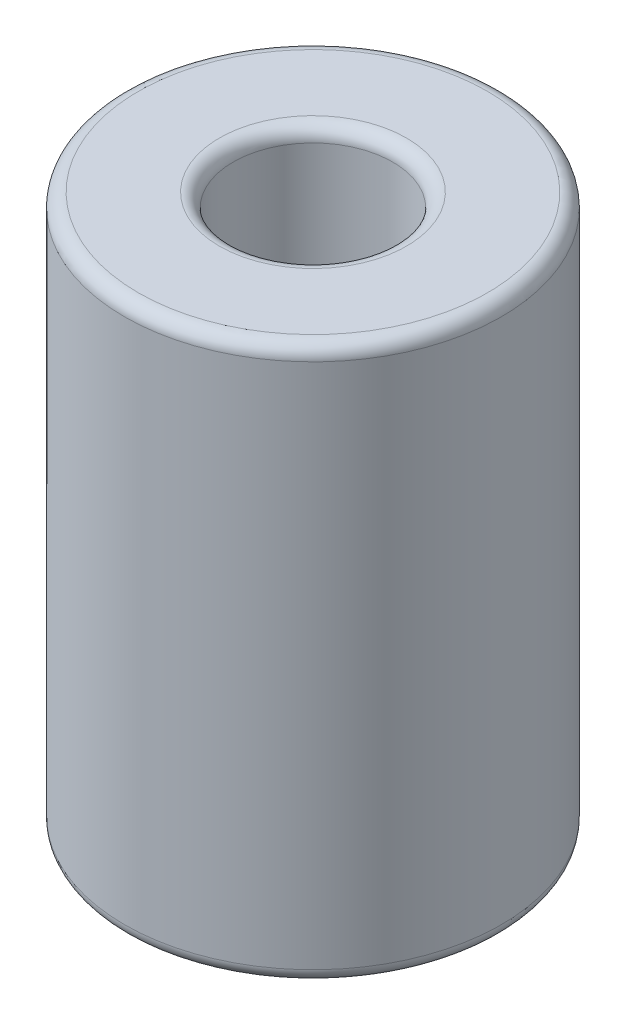
ISO-10303-21;
HEADER;
FILE_DESCRIPTION(('STEP AP214'),'2;1');
FILE_NAME('part.step','',(''),(''),'','','');
FILE_SCHEMA(('AUTOMOTIVE_DESIGN { 1 0 10303 214 1 1 1 1 }'));
ENDSEC;
DATA;
#1=APPLICATION_CONTEXT('core data for automotive mechanical design processes');
#2=APPLICATION_PROTOCOL_DEFINITION('international standard','automotive_design',2000,#1);
#3=PRODUCT_CONTEXT('',#1,'mechanical');
#4=PRODUCT('Part','Part','',(#3));
#5=PRODUCT_RELATED_PRODUCT_CATEGORY('part','',(#4));
#6=PRODUCT_DEFINITION_FORMATION('','',#4);
#7=PRODUCT_DEFINITION_CONTEXT('part definition',#1,'design');
#8=PRODUCT_DEFINITION('design','',#6,#7);
#9=PRODUCT_DEFINITION_SHAPE('','',#8);
#10=(LENGTH_UNIT() NAMED_UNIT(*) SI_UNIT(.MILLI.,.METRE.));
#11=(NAMED_UNIT(*) PLANE_ANGLE_UNIT() SI_UNIT($,.RADIAN.));
#12=(NAMED_UNIT(*) SI_UNIT($,.STERADIAN.) SOLID_ANGLE_UNIT());
#13=UNCERTAINTY_MEASURE_WITH_UNIT(LENGTH_MEASURE(1.E-05),#10,'distance_accuracy_value','');
#14=(GEOMETRIC_REPRESENTATION_CONTEXT(3) GLOBAL_UNCERTAINTY_ASSIGNED_CONTEXT((#13)) GLOBAL_UNIT_ASSIGNED_CONTEXT((#10,
#11,#12)) REPRESENTATION_CONTEXT('',''));
#15=CARTESIAN_POINT('',(0.,0.,0.));
#16=DIRECTION('',(0.,0.,1.));
#17=DIRECTION('',(1.,0.,0.));
#18=AXIS2_PLACEMENT_3D('',#15,#16,#17);
#19=CARTESIAN_POINT('',(0.,15.875,0.));
#20=DIRECTION('',(0.,1.,0.));
#21=DIRECTION('',(0.,0.,1.));
#22=AXIS2_PLACEMENT_3D('',#19,#20,#21);
#23=PLANE('',#22);
#24=CARTESIAN_POINT('',(0.,15.875,0.));
#25=DIRECTION('',(0.,1.,0.));
#26=DIRECTION('',(0.,0.,1.));
#27=AXIS2_PLACEMENT_3D('',#24,#25,#26);
#28=CIRCLE('',#27,2.682875);
#29=CARTESIAN_POINT('',(0.,15.875,2.682875));
#30=VERTEX_POINT('',#29);
#31=EDGE_CURVE('E10',#30,#30,#28,.F.);
#32=ORIENTED_EDGE('',*,*,#31,.T.);
#33=EDGE_LOOP('',(#32));
#34=FACE_BOUND('',#33,.T.);
#35=CARTESIAN_POINT('',(0.,15.875,0.));
#36=DIRECTION('',(0.,1.,0.));
#37=DIRECTION('',(0.,0.,1.));
#38=AXIS2_PLACEMENT_3D('',#35,#36,#37);
#39=CIRCLE('',#38,5.000625);
#40=CARTESIAN_POINT('',(0.,15.875,5.000625));
#41=VERTEX_POINT('',#40);
#42=EDGE_CURVE('E42',#41,#41,#39,.T.);
#43=ORIENTED_EDGE('',*,*,#42,.T.);
#44=EDGE_LOOP('',(#43));
#45=FACE_BOUND('',#44,.T.);
#46=ADVANCED_FACE('F40',(#34,#45),#23,.T.);
#47=CARTESIAN_POINT('',(0.,0.,0.));
#48=DIRECTION('',(0.,1.,0.));
#49=DIRECTION('',(0.,0.,1.));
#50=AXIS2_PLACEMENT_3D('',#47,#48,#49);
#51=PLANE('',#50);
#52=CARTESIAN_POINT('',(0.,0.,0.));
#53=DIRECTION('',(0.,1.,0.));
#54=DIRECTION('',(0.,0.,1.));
#55=AXIS2_PLACEMENT_3D('',#52,#53,#54);
#56=CIRCLE('',#55,2.682875);
#57=CARTESIAN_POINT('',(0.,0.,2.682875));
#58=VERTEX_POINT('',#57);
#59=EDGE_CURVE('E62',#58,#58,#56,.T.);
#60=ORIENTED_EDGE('',*,*,#59,.T.);
#61=EDGE_LOOP('',(#60));
#62=FACE_BOUND('',#61,.T.);
#63=CARTESIAN_POINT('',(0.,0.,0.));
#64=DIRECTION('',(0.,1.,0.));
#65=DIRECTION('',(0.,0.,1.));
#66=AXIS2_PLACEMENT_3D('',#63,#64,#65);
#67=CIRCLE('',#66,5.000625);
#68=CARTESIAN_POINT('',(0.,0.,5.000625));
#69=VERTEX_POINT('',#68);
#70=EDGE_CURVE('E68',#69,#69,#67,.F.);
#71=ORIENTED_EDGE('',*,*,#70,.T.);
#72=EDGE_LOOP('',(#71));
#73=FACE_BOUND('',#72,.T.);
#74=ADVANCED_FACE('F69',(#62,#73),#51,.F.);
#75=CARTESIAN_POINT('',(0.,15.875,0.));
#76=DIRECTION('',(0.,-1.,0.));
#77=DIRECTION('',(0.,0.,-1.));
#78=AXIS2_PLACEMENT_3D('',#75,#76,#77);
#79=CYLINDRICAL_SURFACE('',#78,5.3975);
#80=CARTESIAN_POINT('',(0.,0.396875,0.));
#81=DIRECTION('',(0.,1.,0.));
#82=DIRECTION('',(0.,0.,1.));
#83=AXIS2_PLACEMENT_3D('',#80,#81,#82);
#84=CIRCLE('',#83,5.3975);
#85=CARTESIAN_POINT('',(0.,0.396875,5.3975));
#86=VERTEX_POINT('',#85);
#87=EDGE_CURVE('E48',#86,#86,#84,.T.);
#88=ORIENTED_EDGE('',*,*,#87,.T.);
#89=EDGE_LOOP('',(#88));
#90=FACE_BOUND('',#89,.T.);
#91=CARTESIAN_POINT('',(0.,15.478125,0.));
#92=DIRECTION('',(0.,1.,0.));
#93=DIRECTION('',(0.,0.,1.));
#94=AXIS2_PLACEMENT_3D('',#91,#92,#93);
#95=CIRCLE('',#94,5.3975);
#96=CARTESIAN_POINT('',(0.,15.478125,5.3975));
#97=VERTEX_POINT('',#96);
#98=EDGE_CURVE('E55',#97,#97,#95,.F.);
#99=ORIENTED_EDGE('',*,*,#98,.T.);
#100=EDGE_LOOP('',(#99));
#101=FACE_BOUND('',#100,.T.);
#102=ADVANCED_FACE('F79',(#90,#101),#79,.T.);
#103=CARTESIAN_POINT('',(0.,15.875,0.));
#104=DIRECTION('',(0.,-1.,0.));
#105=DIRECTION('',(0.,0.,-1.));
#106=AXIS2_PLACEMENT_3D('',#103,#104,#105);
#107=CYLINDRICAL_SURFACE('',#106,2.286);
#108=CARTESIAN_POINT('',(0.,0.396875,0.));
#109=DIRECTION('',(0.,1.,0.));
#110=DIRECTION('',(0.,0.,1.));
#111=AXIS2_PLACEMENT_3D('',#108,#109,#110);
#112=CIRCLE('',#111,2.286);
#113=CARTESIAN_POINT('',(0.,0.396875,2.286));
#114=VERTEX_POINT('',#113);
#115=EDGE_CURVE('E60',#114,#114,#112,.F.);
#116=ORIENTED_EDGE('',*,*,#115,.T.);
#117=EDGE_LOOP('',(#116));
#118=FACE_BOUND('',#117,.T.);
#119=CARTESIAN_POINT('',(0.,15.478125,0.));
#120=DIRECTION('',(0.,1.,0.));
#121=DIRECTION('',(0.,0.,1.));
#122=AXIS2_PLACEMENT_3D('',#119,#120,#121);
#123=CIRCLE('',#122,2.286);
#124=CARTESIAN_POINT('',(0.,15.478125,2.286));
#125=VERTEX_POINT('',#124);
#126=EDGE_CURVE('E58',#125,#125,#123,.T.);
#127=ORIENTED_EDGE('',*,*,#126,.T.);
#128=EDGE_LOOP('',(#127));
#129=FACE_BOUND('',#128,.T.);
#130=ADVANCED_FACE('F81',(#118,#129),#107,.F.);
#131=CARTESIAN_POINT('',(0.,0.396875,0.));
#132=DIRECTION('',(0.,1.,0.));
#133=DIRECTION('',(0.,0.,1.));
#134=AXIS2_PLACEMENT_3D('',#131,#132,#133);
#135=TOROIDAL_SURFACE('',#134,2.682875,0.396875);
#136=ORIENTED_EDGE('',*,*,#115,.F.);
#137=EDGE_LOOP('',(#136));
#138=FACE_BOUND('',#137,.T.);
#139=ORIENTED_EDGE('',*,*,#59,.F.);
#140=EDGE_LOOP('',(#139));
#141=FACE_BOUND('',#140,.T.);
#142=ADVANCED_FACE('F76',(#138,#141),#135,.T.);
#143=CARTESIAN_POINT('',(0.,0.396875,0.));
#144=DIRECTION('',(0.,1.,0.));
#145=DIRECTION('',(0.,0.,1.));
#146=AXIS2_PLACEMENT_3D('',#143,#144,#145);
#147=TOROIDAL_SURFACE('',#146,5.000625,0.396875);
#148=ORIENTED_EDGE('',*,*,#70,.F.);
#149=EDGE_LOOP('',(#148));
#150=FACE_BOUND('',#149,.T.);
#151=ORIENTED_EDGE('',*,*,#87,.F.);
#152=EDGE_LOOP('',(#151));
#153=FACE_BOUND('',#152,.T.);
#154=ADVANCED_FACE('F75',(#150,#153),#147,.T.);
#155=CARTESIAN_POINT('',(0.,15.478125,0.));
#156=DIRECTION('',(0.,1.,0.));
#157=DIRECTION('',(0.,0.,1.));
#158=AXIS2_PLACEMENT_3D('',#155,#156,#157);
#159=TOROIDAL_SURFACE('',#158,2.682875,0.396875);
#160=ORIENTED_EDGE('',*,*,#31,.F.);
#161=EDGE_LOOP('',(#160));
#162=FACE_BOUND('',#161,.T.);
#163=ORIENTED_EDGE('',*,*,#126,.F.);
#164=EDGE_LOOP('',(#163));
#165=FACE_BOUND('',#164,.T.);
#166=ADVANCED_FACE('F73',(#162,#165),#159,.T.);
#167=CARTESIAN_POINT('',(0.,15.478125,0.));
#168=DIRECTION('',(0.,1.,0.));
#169=DIRECTION('',(0.,0.,1.));
#170=AXIS2_PLACEMENT_3D('',#167,#168,#169);
#171=TOROIDAL_SURFACE('',#170,5.000625,0.396875);
#172=ORIENTED_EDGE('',*,*,#98,.F.);
#173=EDGE_LOOP('',(#172));
#174=FACE_BOUND('',#173,.T.);
#175=ORIENTED_EDGE('',*,*,#42,.F.);
#176=EDGE_LOOP('',(#175));
#177=FACE_BOUND('',#176,.T.);
#178=ADVANCED_FACE('F39',(#174,#177),#171,.T.);
#179=CLOSED_SHELL('',(#46,#74,#102,#130,#142,#154,#166,#178));
#180=MANIFOLD_SOLID_BREP('B2',#179);
#181=ADVANCED_BREP_SHAPE_REPRESENTATION('',(#18,#180),#14);
#182=SHAPE_DEFINITION_REPRESENTATION(#9,#181);
ENDSEC;
END-ISO-10303-21;
